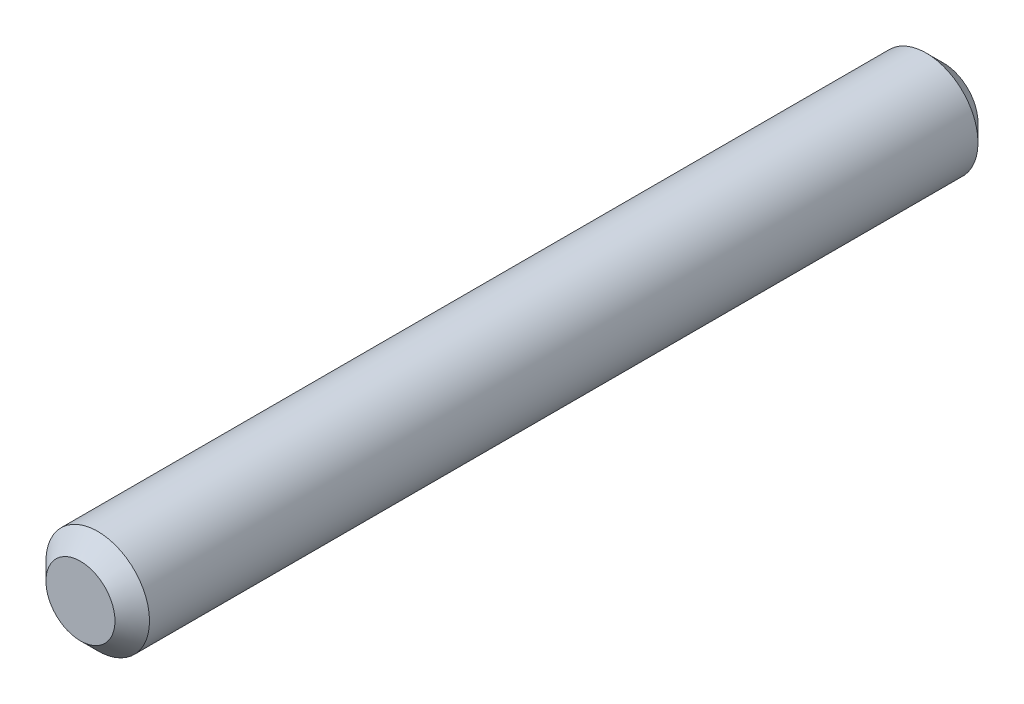
ISO-10303-21;
HEADER;
FILE_DESCRIPTION(('STEP AP214'),'2;1');
FILE_NAME('part.step','',(''),(''),'','','');
FILE_SCHEMA(('AUTOMOTIVE_DESIGN { 1 0 10303 214 1 1 1 1 }'));
ENDSEC;
DATA;
#1=APPLICATION_CONTEXT('core data for automotive mechanical design processes');
#2=APPLICATION_PROTOCOL_DEFINITION('international standard','automotive_design',2000,#1);
#3=PRODUCT_CONTEXT('',#1,'mechanical');
#4=PRODUCT('Part','Part','',(#3));
#5=PRODUCT_RELATED_PRODUCT_CATEGORY('part','',(#4));
#6=PRODUCT_DEFINITION_FORMATION('','',#4);
#7=PRODUCT_DEFINITION_CONTEXT('part definition',#1,'design');
#8=PRODUCT_DEFINITION('design','',#6,#7);
#9=PRODUCT_DEFINITION_SHAPE('','',#8);
#10=(LENGTH_UNIT() NAMED_UNIT(*) SI_UNIT(.MILLI.,.METRE.));
#11=(NAMED_UNIT(*) PLANE_ANGLE_UNIT() SI_UNIT($,.RADIAN.));
#12=(NAMED_UNIT(*) SI_UNIT($,.STERADIAN.) SOLID_ANGLE_UNIT());
#13=UNCERTAINTY_MEASURE_WITH_UNIT(LENGTH_MEASURE(1.E-05),#10,'distance_accuracy_value','');
#14=(GEOMETRIC_REPRESENTATION_CONTEXT(3) GLOBAL_UNCERTAINTY_ASSIGNED_CONTEXT((#13)) GLOBAL_UNIT_ASSIGNED_CONTEXT((#10,
#11,#12)) REPRESENTATION_CONTEXT('',''));
#15=CARTESIAN_POINT('',(0.,0.,0.));
#16=DIRECTION('',(0.,0.,1.));
#17=DIRECTION('',(1.,0.,0.));
#18=AXIS2_PLACEMENT_3D('',#15,#16,#17);
#19=CARTESIAN_POINT('',(0.,0.,25.));
#20=DIRECTION('',(0.,0.,-1.));
#21=DIRECTION('',(-1.,0.,0.));
#22=AXIS2_PLACEMENT_3D('',#19,#20,#21);
#23=CYLINDRICAL_SURFACE('',#22,1.5);
#24=CARTESIAN_POINT('',(0.,0.,0.5));
#25=DIRECTION('',(0.,0.,1.));
#26=DIRECTION('',(1.,0.,0.));
#27=AXIS2_PLACEMENT_3D('',#24,#25,#26);
#28=CIRCLE('',#27,1.5);
#29=CARTESIAN_POINT('',(1.5,0.,0.5));
#30=VERTEX_POINT('',#29);
#31=EDGE_CURVE('E68',#30,#30,#28,.T.);
#32=ORIENTED_EDGE('',*,*,#31,.T.);
#33=EDGE_LOOP('',(#32));
#34=FACE_BOUND('',#33,.T.);
#35=CARTESIAN_POINT('',(0.,0.,24.5));
#36=DIRECTION('',(0.,0.,1.));
#37=DIRECTION('',(1.,0.,0.));
#38=AXIS2_PLACEMENT_3D('',#35,#36,#37);
#39=CIRCLE('',#38,1.5);
#40=CARTESIAN_POINT('',(1.5,0.,24.5));
#41=VERTEX_POINT('',#40);
#42=EDGE_CURVE('E73',#41,#41,#39,.F.);
#43=ORIENTED_EDGE('',*,*,#42,.T.);
#44=EDGE_LOOP('',(#43));
#45=FACE_BOUND('',#44,.T.);
#46=ADVANCED_FACE('F54',(#34,#45),#23,.T.);
#47=CARTESIAN_POINT('',(0.,0.,25.));
#48=DIRECTION('',(0.,0.,1.));
#49=DIRECTION('',(1.,0.,0.));
#50=AXIS2_PLACEMENT_3D('',#47,#48,#49);
#51=PLANE('',#50);
#52=CARTESIAN_POINT('',(0.,0.,25.));
#53=DIRECTION('',(0.,0.,1.));
#54=DIRECTION('',(1.,0.,0.));
#55=AXIS2_PLACEMENT_3D('',#52,#53,#54);
#56=CIRCLE('',#55,1.);
#57=CARTESIAN_POINT('',(1.,0.,25.));
#58=VERTEX_POINT('',#57);
#59=EDGE_CURVE('E12',#58,#58,#56,.T.);
#60=ORIENTED_EDGE('',*,*,#59,.T.);
#61=EDGE_LOOP('',(#60));
#62=FACE_BOUND('',#61,.T.);
#63=ADVANCED_FACE('F90',(#62),#51,.T.);
#64=CARTESIAN_POINT('',(0.,0.,0.));
#65=DIRECTION('',(0.,0.,1.));
#66=DIRECTION('',(1.,0.,0.));
#67=AXIS2_PLACEMENT_3D('',#64,#65,#66);
#68=PLANE('',#67);
#69=CARTESIAN_POINT('',(0.,0.,0.));
#70=DIRECTION('',(0.,0.,1.));
#71=DIRECTION('',(1.,0.,0.));
#72=AXIS2_PLACEMENT_3D('',#69,#70,#71);
#73=CIRCLE('',#72,0.999999999999998);
#74=CARTESIAN_POINT('',(0.999999999999998,0.,0.));
#75=VERTEX_POINT('',#74);
#76=EDGE_CURVE('E63',#75,#75,#73,.F.);
#77=ORIENTED_EDGE('',*,*,#76,.T.);
#78=EDGE_LOOP('',(#77));
#79=FACE_BOUND('',#78,.T.);
#80=ADVANCED_FACE('F87',(#79),#68,.F.);
#81=CARTESIAN_POINT('',(0.,0.,0.5));
#82=DIRECTION('',(0.,0.,1.));
#83=DIRECTION('',(1.,0.,0.));
#84=AXIS2_PLACEMENT_3D('',#81,#82,#83);
#85=CONICAL_SURFACE('',#84,1.5,0.78539816339745);
#86=ORIENTED_EDGE('',*,*,#76,.F.);
#87=EDGE_LOOP('',(#86));
#88=FACE_BOUND('',#87,.T.);
#89=ORIENTED_EDGE('',*,*,#31,.F.);
#90=EDGE_LOOP('',(#89));
#91=FACE_BOUND('',#90,.T.);
#92=ADVANCED_FACE('F83',(#88,#91),#85,.T.);
#93=CARTESIAN_POINT('',(0.,0.,25.));
#94=DIRECTION('',(0.,0.,-1.));
#95=DIRECTION('',(-1.,0.,0.));
#96=AXIS2_PLACEMENT_3D('',#93,#94,#95);
#97=CONICAL_SURFACE('',#96,1.,0.785398163397447);
#98=ORIENTED_EDGE('',*,*,#42,.F.);
#99=EDGE_LOOP('',(#98));
#100=FACE_BOUND('',#99,.T.);
#101=ORIENTED_EDGE('',*,*,#59,.F.);
#102=EDGE_LOOP('',(#101));
#103=FACE_BOUND('',#102,.T.);
#104=ADVANCED_FACE('F57',(#100,#103),#97,.T.);
#105=CLOSED_SHELL('',(#46,#63,#80,#92,#104));
#106=MANIFOLD_SOLID_BREP('B2',#105);
#107=ADVANCED_BREP_SHAPE_REPRESENTATION('',(#18,#106),#14);
#108=SHAPE_DEFINITION_REPRESENTATION(#9,#107);
ENDSEC;
END-ISO-10303-21;
